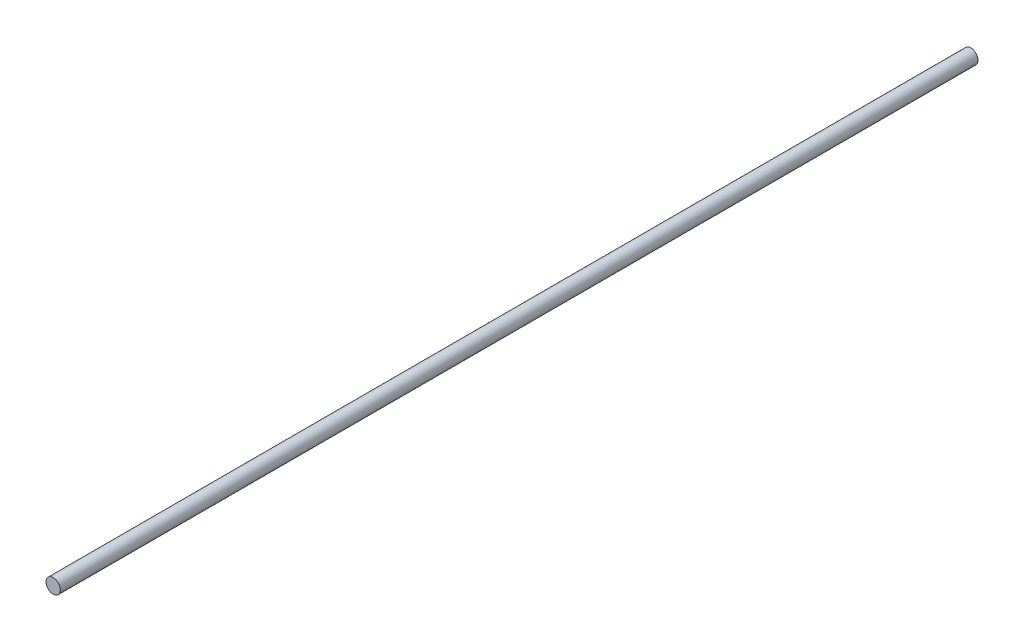
ISO-10303-21;
HEADER;
FILE_DESCRIPTION(('STEP AP214'),'2;1');
FILE_NAME('part.step','',(''),(''),'','','');
FILE_SCHEMA(('AUTOMOTIVE_DESIGN { 1 0 10303 214 1 1 1 1 }'));
ENDSEC;
DATA;
#1=APPLICATION_CONTEXT('core data for automotive mechanical design processes');
#2=APPLICATION_PROTOCOL_DEFINITION('international standard','automotive_design',2000,#1);
#3=PRODUCT_CONTEXT('',#1,'mechanical');
#4=PRODUCT('Part','Part','',(#3));
#5=PRODUCT_RELATED_PRODUCT_CATEGORY('part','',(#4));
#6=PRODUCT_DEFINITION_FORMATION('','',#4);
#7=PRODUCT_DEFINITION_CONTEXT('part definition',#1,'design');
#8=PRODUCT_DEFINITION('design','',#6,#7);
#9=PRODUCT_DEFINITION_SHAPE('','',#8);
#10=(LENGTH_UNIT() NAMED_UNIT(*) SI_UNIT(.MILLI.,.METRE.));
#11=(NAMED_UNIT(*) PLANE_ANGLE_UNIT() SI_UNIT($,.RADIAN.));
#12=(NAMED_UNIT(*) SI_UNIT($,.STERADIAN.) SOLID_ANGLE_UNIT());
#13=UNCERTAINTY_MEASURE_WITH_UNIT(LENGTH_MEASURE(1.E-05),#10,'distance_accuracy_value','');
#14=(GEOMETRIC_REPRESENTATION_CONTEXT(3) GLOBAL_UNCERTAINTY_ASSIGNED_CONTEXT((#13)) GLOBAL_UNIT_ASSIGNED_CONTEXT((#10,
#11,#12)) REPRESENTATION_CONTEXT('',''));
#15=CARTESIAN_POINT('',(0.,0.,0.));
#16=DIRECTION('',(0.,0.,1.));
#17=DIRECTION('',(1.,0.,0.));
#18=AXIS2_PLACEMENT_3D('',#15,#16,#17);
#19=CARTESIAN_POINT('',(0.,0.,152.4));
#20=DIRECTION('',(0.,0.,-1.));
#21=DIRECTION('',(-1.,0.,0.));
#22=AXIS2_PLACEMENT_3D('',#19,#20,#21);
#23=CYLINDRICAL_SURFACE('',#22,2.38125);
#24=CARTESIAN_POINT('',(0.,0.,152.4));
#25=DIRECTION('',(0.,0.,1.));
#26=DIRECTION('',(1.,0.,0.));
#27=AXIS2_PLACEMENT_3D('',#24,#25,#26);
#28=CIRCLE('',#27,2.38125);
#29=CARTESIAN_POINT('',(-2.38125,0.,152.4));
#30=VERTEX_POINT('',#29);
#31=EDGE_CURVE('E10',#30,#30,#28,.T.);
#32=CARTESIAN_POINT('',(0.,0.,-152.4));
#33=DIRECTION('',(0.,0.,1.));
#34=DIRECTION('',(1.,0.,0.));
#35=AXIS2_PLACEMENT_3D('',#32,#33,#34);
#36=CIRCLE('',#35,2.38125);
#37=CARTESIAN_POINT('',(-2.38125,0.,-152.4));
#38=VERTEX_POINT('',#37);
#39=EDGE_CURVE('E35',#38,#38,#36,.T.);
#40=CARTESIAN_POINT('',(-2.38125,0.,152.4));
#41=CARTESIAN_POINT('',(-2.38125,0.,149.225));
#42=CARTESIAN_POINT('',(-2.38125,0.,146.05));
#43=CARTESIAN_POINT('',(-2.38125,0.,139.7));
#44=CARTESIAN_POINT('',(-2.38125,0.,136.525));
#45=CARTESIAN_POINT('',(-2.38125,0.,130.175));
#46=CARTESIAN_POINT('',(-2.38125,0.,127.));
#47=CARTESIAN_POINT('',(-2.38125,0.,120.65));
#48=CARTESIAN_POINT('',(-2.38125,0.,117.475));
#49=CARTESIAN_POINT('',(-2.38125,0.,111.125));
#50=CARTESIAN_POINT('',(-2.38125,0.,107.95));
#51=CARTESIAN_POINT('',(-2.38125,0.,101.6));
#52=CARTESIAN_POINT('',(-2.38125,0.,98.425));
#53=CARTESIAN_POINT('',(-2.38125,0.,92.075));
#54=CARTESIAN_POINT('',(-2.38125,0.,88.9));
#55=CARTESIAN_POINT('',(-2.38125,0.,82.55));
#56=CARTESIAN_POINT('',(-2.38125,0.,79.375));
#57=CARTESIAN_POINT('',(-2.38125,0.,73.025));
#58=CARTESIAN_POINT('',(-2.38125,0.,69.85));
#59=CARTESIAN_POINT('',(-2.38125,0.,63.5));
#60=CARTESIAN_POINT('',(-2.38125,0.,60.325));
#61=CARTESIAN_POINT('',(-2.38125,0.,53.975));
#62=CARTESIAN_POINT('',(-2.38125,0.,50.8));
#63=CARTESIAN_POINT('',(-2.38125,0.,44.45));
#64=CARTESIAN_POINT('',(-2.38125,0.,41.275));
#65=CARTESIAN_POINT('',(-2.38125,0.,34.925));
#66=CARTESIAN_POINT('',(-2.38125,0.,31.75));
#67=CARTESIAN_POINT('',(-2.38125,0.,25.4));
#68=CARTESIAN_POINT('',(-2.38125,0.,22.225));
#69=CARTESIAN_POINT('',(-2.38125,0.,15.875));
#70=CARTESIAN_POINT('',(-2.38125,0.,12.7));
#71=CARTESIAN_POINT('',(-2.38125,0.,6.34999999999998));
#72=CARTESIAN_POINT('',(-2.38125,0.,3.17499999999997));
#73=CARTESIAN_POINT('',(-2.38125,0.,-3.17500000000003));
#74=CARTESIAN_POINT('',(-2.38125,0.,-6.35000000000003));
#75=CARTESIAN_POINT('',(-2.38125,0.,-12.7));
#76=CARTESIAN_POINT('',(-2.38125,0.,-15.875));
#77=CARTESIAN_POINT('',(-2.38125,0.,-22.225));
#78=CARTESIAN_POINT('',(-2.38125,0.,-25.4));
#79=CARTESIAN_POINT('',(-2.38125,0.,-31.75));
#80=CARTESIAN_POINT('',(-2.38125,0.,-34.925));
#81=CARTESIAN_POINT('',(-2.38125,0.,-41.275));
#82=CARTESIAN_POINT('',(-2.38125,0.,-44.45));
#83=CARTESIAN_POINT('',(-2.38125,0.,-50.8));
#84=CARTESIAN_POINT('',(-2.38125,0.,-53.975));
#85=CARTESIAN_POINT('',(-2.38125,0.,-60.325));
#86=CARTESIAN_POINT('',(-2.38125,0.,-63.5));
#87=CARTESIAN_POINT('',(-2.38125,0.,-69.85));
#88=CARTESIAN_POINT('',(-2.38125,0.,-73.025));
#89=CARTESIAN_POINT('',(-2.38125,0.,-79.375));
#90=CARTESIAN_POINT('',(-2.38125,0.,-82.5500000000001));
#91=CARTESIAN_POINT('',(-2.38125,0.,-88.9));
#92=CARTESIAN_POINT('',(-2.38125,0.,-92.0750000000001));
#93=CARTESIAN_POINT('',(-2.38125,0.,-98.425));
#94=CARTESIAN_POINT('',(-2.38125,0.,-101.6));
#95=CARTESIAN_POINT('',(-2.38125,0.,-107.95));
#96=CARTESIAN_POINT('',(-2.38125,0.,-111.125));
#97=CARTESIAN_POINT('',(-2.38125,0.,-117.475));
#98=CARTESIAN_POINT('',(-2.38125,0.,-120.65));
#99=CARTESIAN_POINT('',(-2.38125,0.,-127.));
#100=CARTESIAN_POINT('',(-2.38125,0.,-130.175));
#101=CARTESIAN_POINT('',(-2.38125,0.,-136.525));
#102=CARTESIAN_POINT('',(-2.38125,0.,-139.7));
#103=CARTESIAN_POINT('',(-2.38125,0.,-146.05));
#104=CARTESIAN_POINT('',(-2.38125,0.,-149.225));
#105=CARTESIAN_POINT('',(-2.38125,0.,-152.4));
#106=B_SPLINE_CURVE_WITH_KNOTS('',3,(#40,#41,#42,#43,#44,#45,#46,#47,#48,#49,#50,#51,#52,#53,
#54,#55,#56,#57,#58,#59,#60,#61,#62,#63,#64,#65,#66,#67,#68,#69,#70,#71,#72,#73,#74,#75,#76,#77,
#78,#79,#80,#81,#82,#83,#84,#85,#86,#87,#88,#89,#90,#91,#92,#93,#94,#95,#96,#97,#98,#99,#100,
#101,#102,#103,#104,#105),.UNSPECIFIED.,.F.,.F.,(4,2,2,2,2,2,2,2,2,2,2,2,2,2,2,2,2,2,2,2,2,2,2,
2,2,2,2,2,2,2,2,2,4),(0.,9.52499999999998,19.05,28.575,38.1,47.625,57.15,66.675,76.2,85.725,
95.25,104.775,114.3,123.825,133.35,142.875,152.4,161.925,171.45,180.975,190.5,200.025,209.55,
219.075,228.6,238.125,247.65,257.175,266.7,276.225,285.75,295.275,304.8),.UNSPECIFIED.);
#107=EDGE_CURVE('BSEAM32',#30,#38,#106,.T.);
#108=ORIENTED_EDGE('',*,*,#31,.F.);
#109=ORIENTED_EDGE('',*,*,#39,.T.);
#110=ORIENTED_EDGE('',*,*,#107,.T.);
#111=ORIENTED_EDGE('',*,*,#107,.F.);
#112=EDGE_LOOP('',(#108,#110,#109,#111));
#113=FACE_BOUND('',#112,.T.);
#114=ADVANCED_FACE('F32',(#113),#23,.T.);
#115=CARTESIAN_POINT('',(0.,0.,152.4));
#116=DIRECTION('',(0.,0.,1.));
#117=DIRECTION('',(1.,0.,0.));
#118=AXIS2_PLACEMENT_3D('',#115,#116,#117);
#119=PLANE('',#118);
#120=ORIENTED_EDGE('',*,*,#31,.T.);
#121=EDGE_LOOP('',(#120));
#122=FACE_BOUND('',#121,.T.);
#123=ADVANCED_FACE('F47',(#122),#119,.T.);
#124=CARTESIAN_POINT('',(0.,0.,-152.4));
#125=DIRECTION('',(0.,0.,1.));
#126=DIRECTION('',(1.,0.,0.));
#127=AXIS2_PLACEMENT_3D('',#124,#125,#126);
#128=PLANE('',#127);
#129=ORIENTED_EDGE('',*,*,#39,.F.);
#130=EDGE_LOOP('',(#129));
#131=FACE_BOUND('',#130,.T.);
#132=ADVANCED_FACE('F45',(#131),#128,.F.);
#133=CLOSED_SHELL('',(#114,#123,#132));
#134=MANIFOLD_SOLID_BREP('B2',#133);
#135=ADVANCED_BREP_SHAPE_REPRESENTATION('',(#18,#134),#14);
#136=SHAPE_DEFINITION_REPRESENTATION(#9,#135);
ENDSEC;
END-ISO-10303-21;
